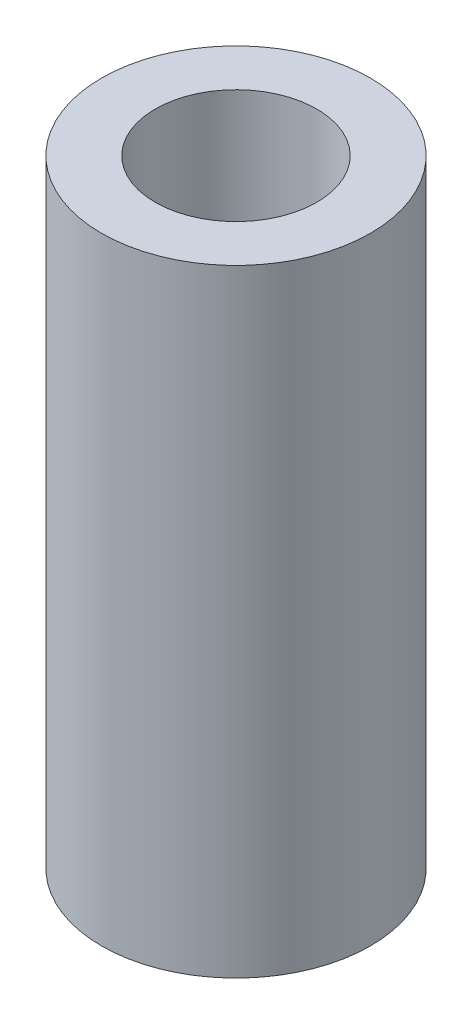
ISO-10303-21;
HEADER;
FILE_DESCRIPTION(('STEP AP214'),'2;1');
FILE_NAME('part.step','',(''),(''),'','','');
FILE_SCHEMA(('AUTOMOTIVE_DESIGN { 1 0 10303 214 1 1 1 1 }'));
ENDSEC;
DATA;
#1=APPLICATION_CONTEXT('core data for automotive mechanical design processes');
#2=APPLICATION_PROTOCOL_DEFINITION('international standard','automotive_design',2000,#1);
#3=PRODUCT_CONTEXT('',#1,'mechanical');
#4=PRODUCT('Part','Part','',(#3));
#5=PRODUCT_RELATED_PRODUCT_CATEGORY('part','',(#4));
#6=PRODUCT_DEFINITION_FORMATION('','',#4);
#7=PRODUCT_DEFINITION_CONTEXT('part definition',#1,'design');
#8=PRODUCT_DEFINITION('design','',#6,#7);
#9=PRODUCT_DEFINITION_SHAPE('','',#8);
#10=(LENGTH_UNIT() NAMED_UNIT(*) SI_UNIT(.MILLI.,.METRE.));
#11=(NAMED_UNIT(*) PLANE_ANGLE_UNIT() SI_UNIT($,.RADIAN.));
#12=(NAMED_UNIT(*) SI_UNIT($,.STERADIAN.) SOLID_ANGLE_UNIT());
#13=UNCERTAINTY_MEASURE_WITH_UNIT(LENGTH_MEASURE(1.E-05),#10,'distance_accuracy_value','');
#14=(GEOMETRIC_REPRESENTATION_CONTEXT(3) GLOBAL_UNCERTAINTY_ASSIGNED_CONTEXT((#13)) GLOBAL_UNIT_ASSIGNED_CONTEXT((#10,
#11,#12)) REPRESENTATION_CONTEXT('',''));
#15=CARTESIAN_POINT('',(0.,0.,0.));
#16=DIRECTION('',(0.,0.,1.));
#17=DIRECTION('',(1.,0.,0.));
#18=AXIS2_PLACEMENT_3D('',#15,#16,#17);
#19=CARTESIAN_POINT('',(0.,9.094875003,0.));
#20=DIRECTION('',(0.,1.,0.));
#21=DIRECTION('',(0.,0.,1.));
#22=AXIS2_PLACEMENT_3D('',#19,#20,#21);
#23=PLANE('',#22);
#24=CARTESIAN_POINT('',(0.,9.094875003,0.));
#25=DIRECTION('',(0.,1.,0.));
#26=DIRECTION('',(0.,0.,1.));
#27=AXIS2_PLACEMENT_3D('',#24,#25,#26);
#28=CIRCLE('',#27,3.9624);
#29=CARTESIAN_POINT('',(0.,9.094875003,3.9624));
#30=VERTEX_POINT('',#29);
#31=EDGE_CURVE('E12',#30,#30,#28,.T.);
#32=ORIENTED_EDGE('',*,*,#31,.T.);
#33=EDGE_LOOP('',(#32));
#34=FACE_BOUND('',#33,.T.);
#35=CARTESIAN_POINT('',(0.,9.094875003,0.));
#36=DIRECTION('',(0.,1.,0.));
#37=DIRECTION('',(0.,0.,1.));
#38=AXIS2_PLACEMENT_3D('',#35,#36,#37);
#39=CIRCLE('',#38,2.38125);
#40=CARTESIAN_POINT('',(0.,9.094875003,2.38125));
#41=VERTEX_POINT('',#40);
#42=EDGE_CURVE('E54',#41,#41,#39,.T.);
#43=ORIENTED_EDGE('',*,*,#42,.F.);
#44=EDGE_LOOP('',(#43));
#45=FACE_BOUND('',#44,.T.);
#46=ADVANCED_FACE('F43',(#34,#45),#23,.T.);
#47=CARTESIAN_POINT('',(0.,-9.094875003,0.));
#48=DIRECTION('',(0.,1.,0.));
#49=DIRECTION('',(0.,0.,1.));
#50=AXIS2_PLACEMENT_3D('',#47,#48,#49);
#51=PLANE('',#50);
#52=CARTESIAN_POINT('',(0.,-9.094875003,0.));
#53=DIRECTION('',(0.,1.,0.));
#54=DIRECTION('',(0.,0.,1.));
#55=AXIS2_PLACEMENT_3D('',#52,#53,#54);
#56=CIRCLE('',#55,3.9624);
#57=CARTESIAN_POINT('',(0.,-9.094875003,3.9624));
#58=VERTEX_POINT('',#57);
#59=EDGE_CURVE('E47',#58,#58,#56,.T.);
#60=ORIENTED_EDGE('',*,*,#59,.F.);
#61=EDGE_LOOP('',(#60));
#62=FACE_BOUND('',#61,.T.);
#63=CARTESIAN_POINT('',(0.,-9.094875003,0.));
#64=DIRECTION('',(0.,1.,0.));
#65=DIRECTION('',(0.,0.,1.));
#66=AXIS2_PLACEMENT_3D('',#63,#64,#65);
#67=CIRCLE('',#66,2.38125);
#68=CARTESIAN_POINT('',(0.,-9.094875003,2.38125));
#69=VERTEX_POINT('',#68);
#70=EDGE_CURVE('E56',#69,#69,#67,.T.);
#71=ORIENTED_EDGE('',*,*,#70,.T.);
#72=EDGE_LOOP('',(#71));
#73=FACE_BOUND('',#72,.T.);
#74=ADVANCED_FACE('F66',(#62,#73),#51,.F.);
#75=CARTESIAN_POINT('',(0.,9.094875003,0.));
#76=DIRECTION('',(0.,-1.,0.));
#77=DIRECTION('',(0.,0.,-1.));
#78=AXIS2_PLACEMENT_3D('',#75,#76,#77);
#79=CYLINDRICAL_SURFACE('',#78,3.9624);
#80=ORIENTED_EDGE('',*,*,#31,.F.);
#81=EDGE_LOOP('',(#80));
#82=FACE_BOUND('',#81,.T.);
#83=ORIENTED_EDGE('',*,*,#59,.T.);
#84=EDGE_LOOP('',(#83));
#85=FACE_BOUND('',#84,.T.);
#86=ADVANCED_FACE('F45',(#82,#85),#79,.T.);
#87=CARTESIAN_POINT('',(0.,9.094875003,0.));
#88=DIRECTION('',(0.,-1.,0.));
#89=DIRECTION('',(0.,0.,-1.));
#90=AXIS2_PLACEMENT_3D('',#87,#88,#89);
#91=CYLINDRICAL_SURFACE('',#90,2.38125);
#92=ORIENTED_EDGE('',*,*,#42,.T.);
#93=EDGE_LOOP('',(#92));
#94=FACE_BOUND('',#93,.T.);
#95=ORIENTED_EDGE('',*,*,#70,.F.);
#96=EDGE_LOOP('',(#95));
#97=FACE_BOUND('',#96,.T.);
#98=ADVANCED_FACE('F62',(#94,#97),#91,.F.);
#99=CLOSED_SHELL('',(#46,#74,#86,#98));
#100=MANIFOLD_SOLID_BREP('B2',#99);
#101=ADVANCED_BREP_SHAPE_REPRESENTATION('',(#18,#100),#14);
#102=SHAPE_DEFINITION_REPRESENTATION(#9,#101);
ENDSEC;
END-ISO-10303-21;
